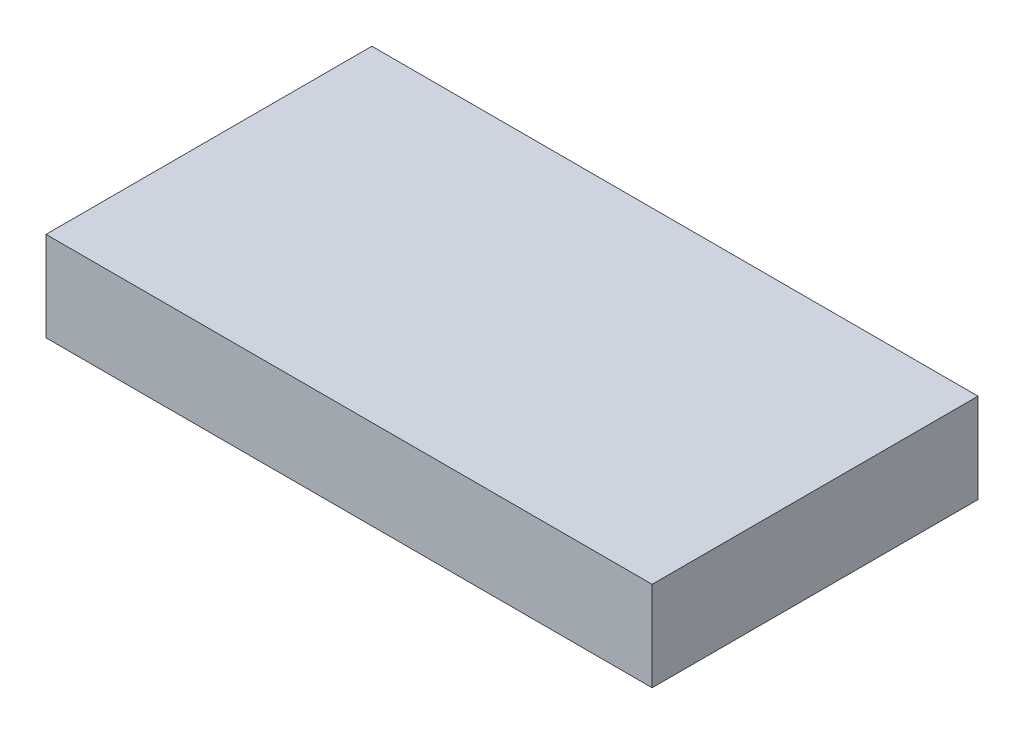
ISO-10303-21;
HEADER;
FILE_DESCRIPTION(('STEP AP214'),'2;1');
FILE_NAME('part.step','',(''),(''),'','','');
FILE_SCHEMA(('AUTOMOTIVE_DESIGN { 1 0 10303 214 1 1 1 1 }'));
ENDSEC;
DATA;
#1=APPLICATION_CONTEXT('core data for automotive mechanical design processes');
#2=APPLICATION_PROTOCOL_DEFINITION('international standard','automotive_design',2000,#1);
#3=PRODUCT_CONTEXT('',#1,'mechanical');
#4=PRODUCT('Part','Part','',(#3));
#5=PRODUCT_RELATED_PRODUCT_CATEGORY('part','',(#4));
#6=PRODUCT_DEFINITION_FORMATION('','',#4);
#7=PRODUCT_DEFINITION_CONTEXT('part definition',#1,'design');
#8=PRODUCT_DEFINITION('design','',#6,#7);
#9=PRODUCT_DEFINITION_SHAPE('','',#8);
#10=(LENGTH_UNIT() NAMED_UNIT(*) SI_UNIT(.MILLI.,.METRE.));
#11=(NAMED_UNIT(*) PLANE_ANGLE_UNIT() SI_UNIT($,.RADIAN.));
#12=(NAMED_UNIT(*) SI_UNIT($,.STERADIAN.) SOLID_ANGLE_UNIT());
#13=UNCERTAINTY_MEASURE_WITH_UNIT(LENGTH_MEASURE(1.E-05),#10,'distance_accuracy_value','');
#14=(GEOMETRIC_REPRESENTATION_CONTEXT(3) GLOBAL_UNCERTAINTY_ASSIGNED_CONTEXT((#13)) GLOBAL_UNIT_ASSIGNED_CONTEXT((#10,
#11,#12)) REPRESENTATION_CONTEXT('',''));
#15=CARTESIAN_POINT('',(0.,0.,0.));
#16=DIRECTION('',(0.,0.,1.));
#17=DIRECTION('',(1.,0.,0.));
#18=AXIS2_PLACEMENT_3D('',#15,#16,#17);
#19=CARTESIAN_POINT('',(0.,5.5,0.));
#20=DIRECTION('',(1.,0.,0.));
#21=DIRECTION('',(0.,0.,-1.));
#22=AXIS2_PLACEMENT_3D('',#19,#20,#21);
#23=PLANE('',#22);
#24=DIRECTION('',(0.,0.,1.));
#25=VECTOR('',#24,1.);
#26=CARTESIAN_POINT('',(0.,0.,0.));
#27=LINE('',#26,#25);
#28=CARTESIAN_POINT('',(0.,0.,-20.));
#29=VERTEX_POINT('',#28);
#30=CARTESIAN_POINT('',(0.,0.,0.));
#31=VERTEX_POINT('',#30);
#32=EDGE_CURVE('E101',#29,#31,#27,.T.);
#33=ORIENTED_EDGE('',*,*,#32,.T.);
#34=DIRECTION('',(0.,-1.,0.));
#35=VECTOR('',#34,1.);
#36=CARTESIAN_POINT('',(0.,5.5,0.));
#37=LINE('',#36,#35);
#38=CARTESIAN_POINT('',(0.,5.5,0.));
#39=VERTEX_POINT('',#38);
#40=EDGE_CURVE('E11',#39,#31,#37,.T.);
#41=ORIENTED_EDGE('',*,*,#40,.F.);
#42=DIRECTION('',(0.,0.,1.));
#43=VECTOR('',#42,1.);
#44=CARTESIAN_POINT('',(0.,5.5,0.));
#45=LINE('',#44,#43);
#46=CARTESIAN_POINT('',(0.,5.5,-20.));
#47=VERTEX_POINT('',#46);
#48=EDGE_CURVE('E89',#47,#39,#45,.T.);
#49=ORIENTED_EDGE('',*,*,#48,.F.);
#50=DIRECTION('',(0.,-1.,0.));
#51=VECTOR('',#50,1.);
#52=CARTESIAN_POINT('',(0.,5.5,-20.));
#53=LINE('',#52,#51);
#54=EDGE_CURVE('E97',#47,#29,#53,.T.);
#55=ORIENTED_EDGE('',*,*,#54,.T.);
#56=EDGE_LOOP('',(#33,#41,#49,#55));
#57=FACE_BOUND('',#56,.T.);
#58=ADVANCED_FACE('F38',(#57),#23,.F.);
#59=CARTESIAN_POINT('',(0.,5.5,0.));
#60=DIRECTION('',(0.,0.,-1.));
#61=DIRECTION('',(-1.,0.,0.));
#62=AXIS2_PLACEMENT_3D('',#59,#60,#61);
#63=PLANE('',#62);
#64=DIRECTION('',(1.,0.,0.));
#65=VECTOR('',#64,1.);
#66=CARTESIAN_POINT('',(0.,0.,0.));
#67=LINE('',#66,#65);
#68=CARTESIAN_POINT('',(37.2,0.,0.));
#69=VERTEX_POINT('',#68);
#70=EDGE_CURVE('E93',#31,#69,#67,.T.);
#71=ORIENTED_EDGE('',*,*,#70,.T.);
#72=DIRECTION('',(0.,-1.,0.));
#73=VECTOR('',#72,1.);
#74=CARTESIAN_POINT('',(37.2,5.5,0.));
#75=LINE('',#74,#73);
#76=CARTESIAN_POINT('',(37.2,5.5,0.));
#77=VERTEX_POINT('',#76);
#78=EDGE_CURVE('E46',#77,#69,#75,.T.);
#79=ORIENTED_EDGE('',*,*,#78,.F.);
#80=DIRECTION('',(1.,0.,0.));
#81=VECTOR('',#80,1.);
#82=CARTESIAN_POINT('',(0.,5.5,0.));
#83=LINE('',#82,#81);
#84=EDGE_CURVE('E84',#39,#77,#83,.T.);
#85=ORIENTED_EDGE('',*,*,#84,.F.);
#86=ORIENTED_EDGE('',*,*,#40,.T.);
#87=EDGE_LOOP('',(#71,#79,#85,#86));
#88=FACE_BOUND('',#87,.T.);
#89=ADVANCED_FACE('F92',(#88),#63,.F.);
#90=CARTESIAN_POINT('',(37.2,5.5,0.));
#91=DIRECTION('',(-1.,0.,0.));
#92=DIRECTION('',(0.,0.,1.));
#93=AXIS2_PLACEMENT_3D('',#90,#91,#92);
#94=PLANE('',#93);
#95=DIRECTION('',(0.,0.,-1.));
#96=VECTOR('',#95,1.);
#97=CARTESIAN_POINT('',(37.2,0.,0.));
#98=LINE('',#97,#96);
#99=CARTESIAN_POINT('',(37.2,0.,-20.));
#100=VERTEX_POINT('',#99);
#101=EDGE_CURVE('E71',#69,#100,#98,.T.);
#102=ORIENTED_EDGE('',*,*,#101,.T.);
#103=DIRECTION('',(0.,-1.,0.));
#104=VECTOR('',#103,1.);
#105=CARTESIAN_POINT('',(37.2,5.5,-20.));
#106=LINE('',#105,#104);
#107=CARTESIAN_POINT('',(37.2,5.5,-20.));
#108=VERTEX_POINT('',#107);
#109=EDGE_CURVE('E94',#108,#100,#106,.T.);
#110=ORIENTED_EDGE('',*,*,#109,.F.);
#111=DIRECTION('',(0.,0.,-1.));
#112=VECTOR('',#111,1.);
#113=CARTESIAN_POINT('',(37.2,5.5,0.));
#114=LINE('',#113,#112);
#115=EDGE_CURVE('E87',#77,#108,#114,.T.);
#116=ORIENTED_EDGE('',*,*,#115,.F.);
#117=ORIENTED_EDGE('',*,*,#78,.T.);
#118=EDGE_LOOP('',(#102,#110,#116,#117));
#119=FACE_BOUND('',#118,.T.);
#120=ADVANCED_FACE('F95',(#119),#94,.F.);
#121=CARTESIAN_POINT('',(0.,5.5,-20.));
#122=DIRECTION('',(0.,0.,1.));
#123=DIRECTION('',(1.,0.,0.));
#124=AXIS2_PLACEMENT_3D('',#121,#122,#123);
#125=PLANE('',#124);
#126=DIRECTION('',(-1.,0.,0.));
#127=VECTOR('',#126,1.);
#128=CARTESIAN_POINT('',(0.,0.,-20.));
#129=LINE('',#128,#127);
#130=EDGE_CURVE('E77',#100,#29,#129,.T.);
#131=ORIENTED_EDGE('',*,*,#130,.T.);
#132=ORIENTED_EDGE('',*,*,#54,.F.);
#133=DIRECTION('',(-1.,0.,0.));
#134=VECTOR('',#133,1.);
#135=CARTESIAN_POINT('',(0.,5.5,-20.));
#136=LINE('',#135,#134);
#137=EDGE_CURVE('E54',#108,#47,#136,.T.);
#138=ORIENTED_EDGE('',*,*,#137,.F.);
#139=ORIENTED_EDGE('',*,*,#109,.T.);
#140=EDGE_LOOP('',(#131,#132,#138,#139));
#141=FACE_BOUND('',#140,.T.);
#142=ADVANCED_FACE('F108',(#141),#125,.F.);
#143=CARTESIAN_POINT('',(0.,5.5,0.));
#144=DIRECTION('',(0.,-1.,0.));
#145=DIRECTION('',(0.,0.,-1.));
#146=AXIS2_PLACEMENT_3D('',#143,#144,#145);
#147=PLANE('',#146);
#148=ORIENTED_EDGE('',*,*,#48,.T.);
#149=ORIENTED_EDGE('',*,*,#84,.T.);
#150=ORIENTED_EDGE('',*,*,#115,.T.);
#151=ORIENTED_EDGE('',*,*,#137,.T.);
#152=EDGE_LOOP('',(#148,#149,#150,#151));
#153=FACE_BOUND('',#152,.T.);
#154=ADVANCED_FACE('F85',(#153),#147,.F.);
#155=CARTESIAN_POINT('',(0.,0.,0.));
#156=DIRECTION('',(0.,-1.,0.));
#157=DIRECTION('',(0.,0.,-1.));
#158=AXIS2_PLACEMENT_3D('',#155,#156,#157);
#159=PLANE('',#158);
#160=ORIENTED_EDGE('',*,*,#32,.F.);
#161=ORIENTED_EDGE('',*,*,#130,.F.);
#162=ORIENTED_EDGE('',*,*,#101,.F.);
#163=ORIENTED_EDGE('',*,*,#70,.F.);
#164=EDGE_LOOP('',(#160,#161,#162,#163));
#165=FACE_BOUND('',#164,.T.);
#166=ADVANCED_FACE('F111',(#165),#159,.T.);
#167=CLOSED_SHELL('',(#58,#89,#120,#142,#154,#166));
#168=MANIFOLD_SOLID_BREP('B2',#167);
#169=ADVANCED_BREP_SHAPE_REPRESENTATION('',(#18,#168),#14);
#170=SHAPE_DEFINITION_REPRESENTATION(#9,#169);
ENDSEC;
END-ISO-10303-21;
